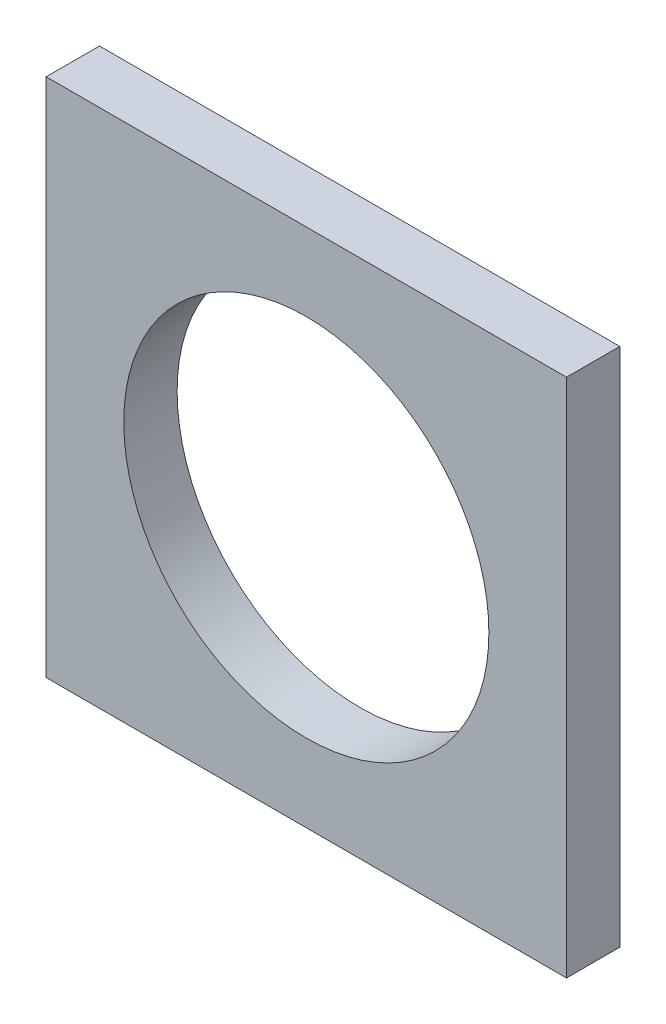
ISO-10303-21;
HEADER;
FILE_DESCRIPTION(('STEP AP214'),'2;1');
FILE_NAME('part.step','',(''),(''),'','','');
FILE_SCHEMA(('AUTOMOTIVE_DESIGN { 1 0 10303 214 1 1 1 1 }'));
ENDSEC;
DATA;
#1=APPLICATION_CONTEXT('core data for automotive mechanical design processes');
#2=APPLICATION_PROTOCOL_DEFINITION('international standard','automotive_design',2000,#1);
#3=PRODUCT_CONTEXT('',#1,'mechanical');
#4=PRODUCT('Part','Part','',(#3));
#5=PRODUCT_RELATED_PRODUCT_CATEGORY('part','',(#4));
#6=PRODUCT_DEFINITION_FORMATION('','',#4);
#7=PRODUCT_DEFINITION_CONTEXT('part definition',#1,'design');
#8=PRODUCT_DEFINITION('design','',#6,#7);
#9=PRODUCT_DEFINITION_SHAPE('','',#8);
#10=(LENGTH_UNIT() NAMED_UNIT(*) SI_UNIT(.MILLI.,.METRE.));
#11=(NAMED_UNIT(*) PLANE_ANGLE_UNIT() SI_UNIT($,.RADIAN.));
#12=(NAMED_UNIT(*) SI_UNIT($,.STERADIAN.) SOLID_ANGLE_UNIT());
#13=UNCERTAINTY_MEASURE_WITH_UNIT(LENGTH_MEASURE(1.E-05),#10,'distance_accuracy_value','');
#14=(GEOMETRIC_REPRESENTATION_CONTEXT(3) GLOBAL_UNCERTAINTY_ASSIGNED_CONTEXT((#13)) GLOBAL_UNIT_ASSIGNED_CONTEXT((#10,
#11,#12)) REPRESENTATION_CONTEXT('',''));
#15=CARTESIAN_POINT('',(0.,0.,0.));
#16=DIRECTION('',(0.,0.,1.));
#17=DIRECTION('',(1.,0.,0.));
#18=AXIS2_PLACEMENT_3D('',#15,#16,#17);
#19=CARTESIAN_POINT('',(0.,0.,3.175));
#20=DIRECTION('',(0.,0.,1.));
#21=DIRECTION('',(1.,0.,0.));
#22=AXIS2_PLACEMENT_3D('',#19,#20,#21);
#23=PLANE('',#22);
#24=CARTESIAN_POINT('',(15.494,15.494,3.175));
#25=DIRECTION('',(0.,0.,1.));
#26=DIRECTION('',(1.,0.,0.));
#27=AXIS2_PLACEMENT_3D('',#24,#25,#26);
#28=CIRCLE('',#27,10.8712);
#29=CARTESIAN_POINT('',(26.3652,15.494,3.175));
#30=VERTEX_POINT('',#29);
#31=EDGE_CURVE('E127',#30,#30,#28,.T.);
#32=ORIENTED_EDGE('',*,*,#31,.F.);
#33=EDGE_LOOP('',(#32));
#34=FACE_BOUND('',#33,.T.);
#35=DIRECTION('',(1.,0.,0.));
#36=VECTOR('',#35,1.);
#37=CARTESIAN_POINT('',(0.,30.988,3.175));
#38=LINE('',#37,#36);
#39=CARTESIAN_POINT('',(0.,30.988,3.175));
#40=VERTEX_POINT('',#39);
#41=CARTESIAN_POINT('',(30.988,30.988,3.175));
#42=VERTEX_POINT('',#41);
#43=EDGE_CURVE('E116',#40,#42,#38,.T.);
#44=ORIENTED_EDGE('',*,*,#43,.F.);
#45=DIRECTION('',(0.,1.,0.));
#46=VECTOR('',#45,1.);
#47=CARTESIAN_POINT('',(0.,0.,3.175));
#48=LINE('',#47,#46);
#49=CARTESIAN_POINT('',(0.,0.,3.175));
#50=VERTEX_POINT('',#49);
#51=EDGE_CURVE('E106',#50,#40,#48,.T.);
#52=ORIENTED_EDGE('',*,*,#51,.F.);
#53=DIRECTION('',(1.,0.,0.));
#54=VECTOR('',#53,1.);
#55=CARTESIAN_POINT('',(0.,0.,3.175));
#56=LINE('',#55,#54);
#57=CARTESIAN_POINT('',(30.988,0.,3.175));
#58=VERTEX_POINT('',#57);
#59=EDGE_CURVE('E104',#50,#58,#56,.T.);
#60=ORIENTED_EDGE('',*,*,#59,.T.);
#61=DIRECTION('',(0.,1.,0.));
#62=VECTOR('',#61,1.);
#63=CARTESIAN_POINT('',(30.988,0.,3.175));
#64=LINE('',#63,#62);
#65=EDGE_CURVE('E101',#58,#42,#64,.T.);
#66=ORIENTED_EDGE('',*,*,#65,.T.);
#67=EDGE_LOOP('',(#44,#52,#60,#66));
#68=FACE_BOUND('',#67,.T.);
#69=ADVANCED_FACE('F58',(#34,#68),#23,.T.);
#70=CARTESIAN_POINT('',(0.,0.,0.));
#71=DIRECTION('',(0.,0.,1.));
#72=DIRECTION('',(1.,0.,0.));
#73=AXIS2_PLACEMENT_3D('',#70,#71,#72);
#74=PLANE('',#73);
#75=CARTESIAN_POINT('',(15.494,15.494,0.));
#76=DIRECTION('',(0.,0.,-1.));
#77=DIRECTION('',(-1.,0.,0.));
#78=AXIS2_PLACEMENT_3D('',#75,#76,#77);
#79=CIRCLE('',#78,10.8712);
#80=CARTESIAN_POINT('',(4.6228,15.494,0.));
#81=VERTEX_POINT('',#80);
#82=EDGE_CURVE('E162',#81,#81,#79,.T.);
#83=ORIENTED_EDGE('',*,*,#82,.F.);
#84=EDGE_LOOP('',(#83));
#85=FACE_BOUND('',#84,.T.);
#86=DIRECTION('',(1.,0.,0.));
#87=VECTOR('',#86,1.);
#88=CARTESIAN_POINT('',(0.,30.988,0.));
#89=LINE('',#88,#87);
#90=CARTESIAN_POINT('',(0.,30.988,0.));
#91=VERTEX_POINT('',#90);
#92=CARTESIAN_POINT('',(30.988,30.988,0.));
#93=VERTEX_POINT('',#92);
#94=EDGE_CURVE('E123',#91,#93,#89,.T.);
#95=ORIENTED_EDGE('',*,*,#94,.T.);
#96=DIRECTION('',(0.,1.,0.));
#97=VECTOR('',#96,1.);
#98=CARTESIAN_POINT('',(30.988,0.,0.));
#99=LINE('',#98,#97);
#100=CARTESIAN_POINT('',(30.988,0.,0.));
#101=VERTEX_POINT('',#100);
#102=EDGE_CURVE('E126',#101,#93,#99,.T.);
#103=ORIENTED_EDGE('',*,*,#102,.F.);
#104=DIRECTION('',(1.,0.,0.));
#105=VECTOR('',#104,1.);
#106=CARTESIAN_POINT('',(0.,0.,0.));
#107=LINE('',#106,#105);
#108=CARTESIAN_POINT('',(0.,0.,0.));
#109=VERTEX_POINT('',#108);
#110=EDGE_CURVE('E111',#109,#101,#107,.T.);
#111=ORIENTED_EDGE('',*,*,#110,.F.);
#112=DIRECTION('',(0.,1.,0.));
#113=VECTOR('',#112,1.);
#114=CARTESIAN_POINT('',(0.,0.,0.));
#115=LINE('',#114,#113);
#116=EDGE_CURVE('E118',#109,#91,#115,.T.);
#117=ORIENTED_EDGE('',*,*,#116,.T.);
#118=EDGE_LOOP('',(#95,#103,#111,#117));
#119=FACE_BOUND('',#118,.T.);
#120=ADVANCED_FACE('F133',(#85,#119),#74,.F.);
#121=CARTESIAN_POINT('',(0.,30.988,3.175));
#122=DIRECTION('',(0.,1.,0.));
#123=DIRECTION('',(0.,0.,1.));
#124=AXIS2_PLACEMENT_3D('',#121,#122,#123);
#125=PLANE('',#124);
#126=ORIENTED_EDGE('',*,*,#94,.F.);
#127=DIRECTION('',(0.,0.,-1.));
#128=VECTOR('',#127,1.);
#129=CARTESIAN_POINT('',(0.,30.988,3.175));
#130=LINE('',#129,#128);
#131=EDGE_CURVE('E12',#40,#91,#130,.T.);
#132=ORIENTED_EDGE('',*,*,#131,.F.);
#133=ORIENTED_EDGE('',*,*,#43,.T.);
#134=DIRECTION('',(0.,0.,-1.));
#135=VECTOR('',#134,1.);
#136=CARTESIAN_POINT('',(30.988,30.988,3.175));
#137=LINE('',#136,#135);
#138=EDGE_CURVE('E62',#42,#93,#137,.T.);
#139=ORIENTED_EDGE('',*,*,#138,.T.);
#140=EDGE_LOOP('',(#126,#132,#133,#139));
#141=FACE_BOUND('',#140,.T.);
#142=ADVANCED_FACE('F60',(#141),#125,.T.);
#143=CARTESIAN_POINT('',(0.,0.,3.175));
#144=DIRECTION('',(-1.,0.,0.));
#145=DIRECTION('',(0.,0.,1.));
#146=AXIS2_PLACEMENT_3D('',#143,#144,#145);
#147=PLANE('',#146);
#148=ORIENTED_EDGE('',*,*,#116,.F.);
#149=DIRECTION('',(0.,0.,-1.));
#150=VECTOR('',#149,1.);
#151=CARTESIAN_POINT('',(0.,0.,3.175));
#152=LINE('',#151,#150);
#153=EDGE_CURVE('E68',#50,#109,#152,.T.);
#154=ORIENTED_EDGE('',*,*,#153,.F.);
#155=ORIENTED_EDGE('',*,*,#51,.T.);
#156=ORIENTED_EDGE('',*,*,#131,.T.);
#157=EDGE_LOOP('',(#148,#154,#155,#156));
#158=FACE_BOUND('',#157,.T.);
#159=ADVANCED_FACE('F134',(#158),#147,.T.);
#160=CARTESIAN_POINT('',(0.,0.,3.175));
#161=DIRECTION('',(0.,1.,0.));
#162=DIRECTION('',(0.,0.,1.));
#163=AXIS2_PLACEMENT_3D('',#160,#161,#162);
#164=PLANE('',#163);
#165=ORIENTED_EDGE('',*,*,#110,.T.);
#166=DIRECTION('',(0.,0.,-1.));
#167=VECTOR('',#166,1.);
#168=CARTESIAN_POINT('',(30.988,0.,3.175));
#169=LINE('',#168,#167);
#170=EDGE_CURVE('E109',#58,#101,#169,.T.);
#171=ORIENTED_EDGE('',*,*,#170,.F.);
#172=ORIENTED_EDGE('',*,*,#59,.F.);
#173=ORIENTED_EDGE('',*,*,#153,.T.);
#174=EDGE_LOOP('',(#165,#171,#172,#173));
#175=FACE_BOUND('',#174,.T.);
#176=ADVANCED_FACE('F110',(#175),#164,.F.);
#177=CARTESIAN_POINT('',(30.988,0.,3.175));
#178=DIRECTION('',(-1.,0.,0.));
#179=DIRECTION('',(0.,0.,1.));
#180=AXIS2_PLACEMENT_3D('',#177,#178,#179);
#181=PLANE('',#180);
#182=ORIENTED_EDGE('',*,*,#102,.T.);
#183=ORIENTED_EDGE('',*,*,#138,.F.);
#184=ORIENTED_EDGE('',*,*,#65,.F.);
#185=ORIENTED_EDGE('',*,*,#170,.T.);
#186=EDGE_LOOP('',(#182,#183,#184,#185));
#187=FACE_BOUND('',#186,.T.);
#188=ADVANCED_FACE('F115',(#187),#181,.F.);
#189=CARTESIAN_POINT('',(15.494,15.494,3.2512));
#190=DIRECTION('',(0.,0.,-1.));
#191=DIRECTION('',(-1.,0.,0.));
#192=AXIS2_PLACEMENT_3D('',#189,#190,#191);
#193=CYLINDRICAL_SURFACE('',#192,10.8712);
#194=ORIENTED_EDGE('',*,*,#31,.T.);
#195=EDGE_LOOP('',(#194));
#196=FACE_BOUND('',#195,.T.);
#197=ORIENTED_EDGE('',*,*,#82,.T.);
#198=EDGE_LOOP('',(#197));
#199=FACE_BOUND('',#198,.T.);
#200=ADVANCED_FACE('F153',(#196,#199),#193,.F.);
#201=CLOSED_SHELL('',(#69,#120,#142,#159,#176,#188,#200));
#202=MANIFOLD_SOLID_BREP('B2',#201);
#203=ADVANCED_BREP_SHAPE_REPRESENTATION('',(#18,#202),#14);
#204=SHAPE_DEFINITION_REPRESENTATION(#9,#203);
ENDSEC;
END-ISO-10303-21;
